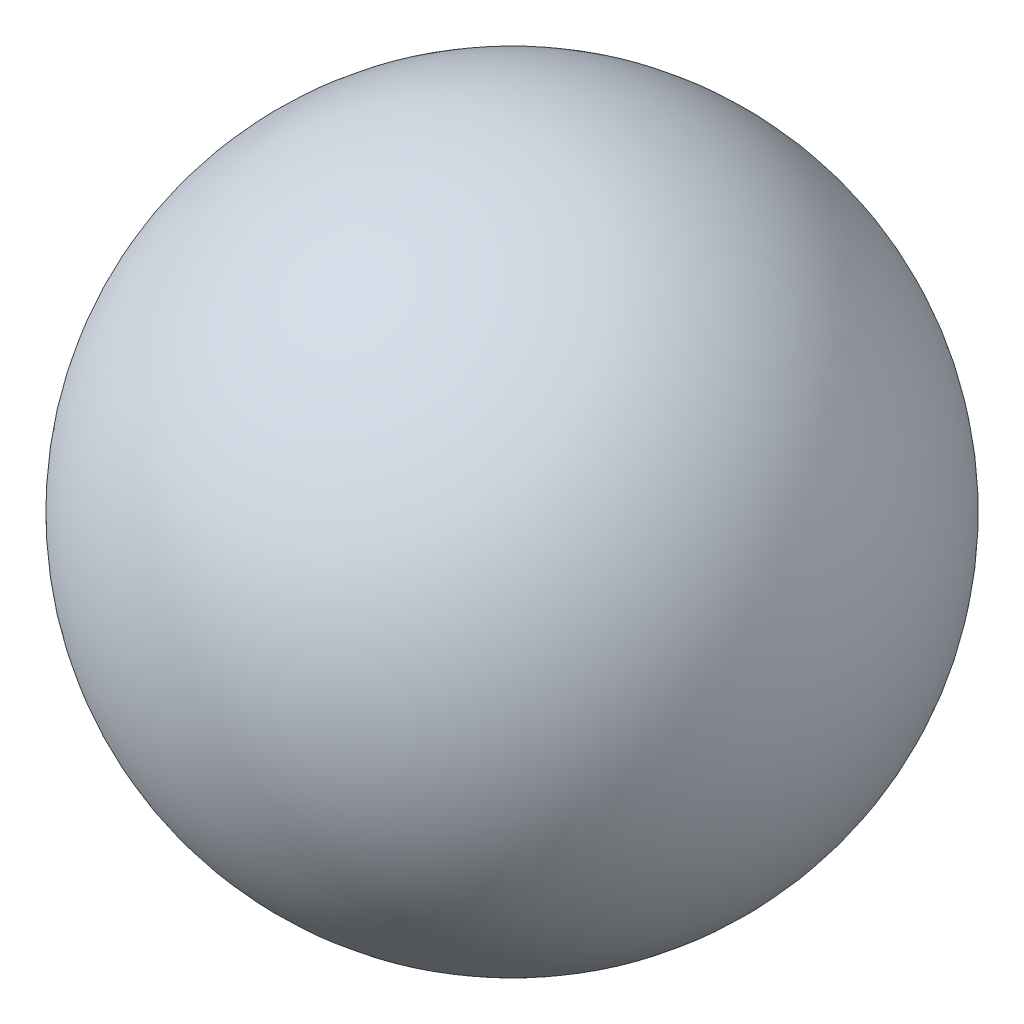
ISO-10303-21;
HEADER;
FILE_DESCRIPTION(('STEP AP214'),'2;1');
FILE_NAME('part.step','',(''),(''),'','','');
FILE_SCHEMA(('AUTOMOTIVE_DESIGN { 1 0 10303 214 1 1 1 1 }'));
ENDSEC;
DATA;
#1=APPLICATION_CONTEXT('core data for automotive mechanical design processes');
#2=APPLICATION_PROTOCOL_DEFINITION('international standard','automotive_design',2000,#1);
#3=PRODUCT_CONTEXT('',#1,'mechanical');
#4=PRODUCT('Part','Part','',(#3));
#5=PRODUCT_RELATED_PRODUCT_CATEGORY('part','',(#4));
#6=PRODUCT_DEFINITION_FORMATION('','',#4);
#7=PRODUCT_DEFINITION_CONTEXT('part definition',#1,'design');
#8=PRODUCT_DEFINITION('design','',#6,#7);
#9=PRODUCT_DEFINITION_SHAPE('','',#8);
#10=(LENGTH_UNIT() NAMED_UNIT(*) SI_UNIT(.MILLI.,.METRE.));
#11=(NAMED_UNIT(*) PLANE_ANGLE_UNIT() SI_UNIT($,.RADIAN.));
#12=(NAMED_UNIT(*) SI_UNIT($,.STERADIAN.) SOLID_ANGLE_UNIT());
#13=UNCERTAINTY_MEASURE_WITH_UNIT(LENGTH_MEASURE(1.E-05),#10,'distance_accuracy_value','');
#14=(GEOMETRIC_REPRESENTATION_CONTEXT(3) GLOBAL_UNCERTAINTY_ASSIGNED_CONTEXT((#13)) GLOBAL_UNIT_ASSIGNED_CONTEXT((#10,
#11,#12)) REPRESENTATION_CONTEXT('',''));
#15=CARTESIAN_POINT('',(0.,0.,0.));
#16=DIRECTION('',(0.,0.,1.));
#17=DIRECTION('',(1.,0.,0.));
#18=AXIS2_PLACEMENT_3D('',#15,#16,#17);
#19=CARTESIAN_POINT('',(0.,0.,0.));
#20=DIRECTION('',(0.,1.,0.));
#21=DIRECTION('',(1.,0.,0.));
#22=AXIS2_PLACEMENT_3D('',#19,#20,#21);
#23=SPHERICAL_SURFACE('',#22,4.);
#24=CARTESIAN_POINT('',(0.,4.,0.));
#25=VERTEX_POINT('',#24);
#26=VERTEX_LOOP('',#25);
#27=FACE_BOUND('',#26,.T.);
#28=ADVANCED_FACE('F29',(#27),#23,.T.);
#29=CLOSED_SHELL('',(#28));
#30=MANIFOLD_SOLID_BREP('B2',#29);
#31=ADVANCED_BREP_SHAPE_REPRESENTATION('',(#18,#30),#14);
#32=SHAPE_DEFINITION_REPRESENTATION(#9,#31);
ENDSEC;
END-ISO-10303-21;
